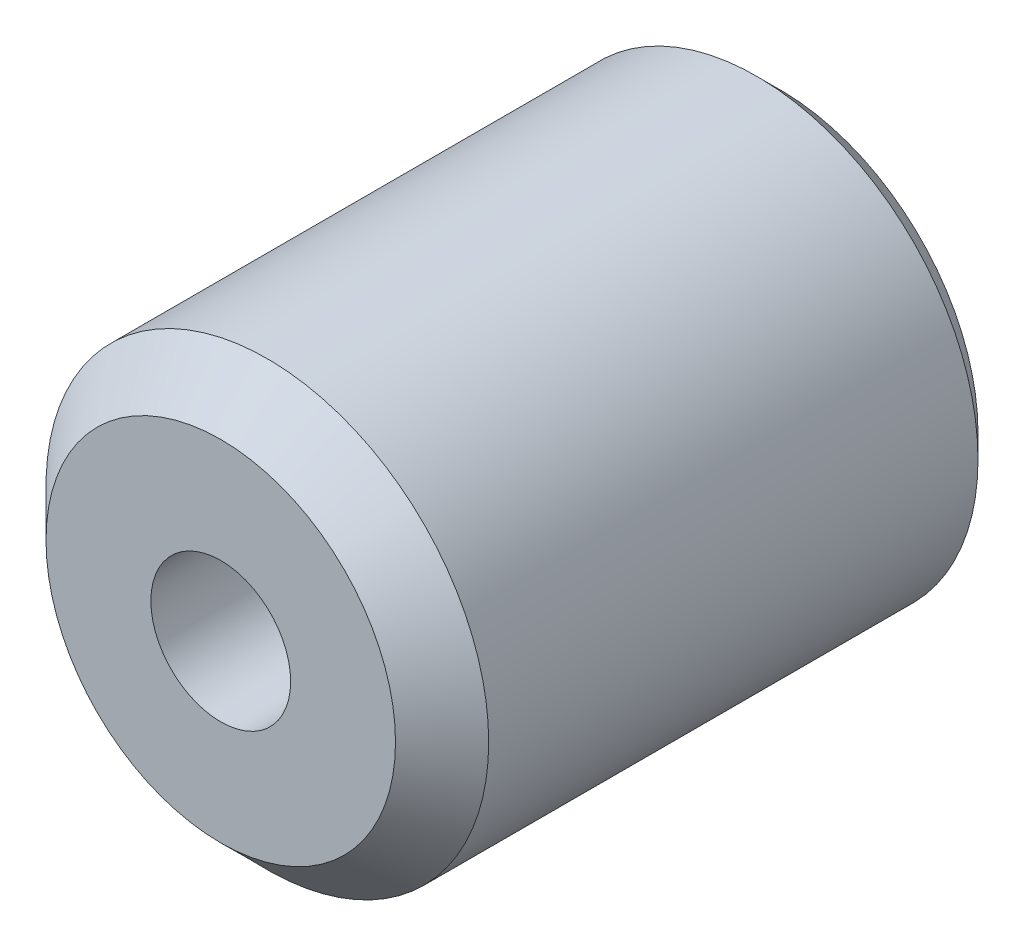
ISO-10303-21;
HEADER;
FILE_DESCRIPTION(('STEP AP214'),'2;1');
FILE_NAME('part.step','',(''),(''),'','','');
FILE_SCHEMA(('AUTOMOTIVE_DESIGN { 1 0 10303 214 1 1 1 1 }'));
ENDSEC;
DATA;
#1=APPLICATION_CONTEXT('core data for automotive mechanical design processes');
#2=APPLICATION_PROTOCOL_DEFINITION('international standard','automotive_design',2000,#1);
#3=PRODUCT_CONTEXT('',#1,'mechanical');
#4=PRODUCT('Part','Part','',(#3));
#5=PRODUCT_RELATED_PRODUCT_CATEGORY('part','',(#4));
#6=PRODUCT_DEFINITION_FORMATION('','',#4);
#7=PRODUCT_DEFINITION_CONTEXT('part definition',#1,'design');
#8=PRODUCT_DEFINITION('design','',#6,#7);
#9=PRODUCT_DEFINITION_SHAPE('','',#8);
#10=(LENGTH_UNIT() NAMED_UNIT(*) SI_UNIT(.MILLI.,.METRE.));
#11=(NAMED_UNIT(*) PLANE_ANGLE_UNIT() SI_UNIT($,.RADIAN.));
#12=(NAMED_UNIT(*) SI_UNIT($,.STERADIAN.) SOLID_ANGLE_UNIT());
#13=UNCERTAINTY_MEASURE_WITH_UNIT(LENGTH_MEASURE(1.E-05),#10,'distance_accuracy_value','');
#14=(GEOMETRIC_REPRESENTATION_CONTEXT(3) GLOBAL_UNCERTAINTY_ASSIGNED_CONTEXT((#13)) GLOBAL_UNIT_ASSIGNED_CONTEXT((#10,
#11,#12)) REPRESENTATION_CONTEXT('',''));
#15=CARTESIAN_POINT('',(0.,0.,0.));
#16=DIRECTION('',(0.,0.,1.));
#17=DIRECTION('',(1.,0.,0.));
#18=AXIS2_PLACEMENT_3D('',#15,#16,#17);
#19=CARTESIAN_POINT('',(0.,0.,12.));
#20=DIRECTION('',(0.,0.,-1.));
#21=DIRECTION('',(-1.,0.,0.));
#22=AXIS2_PLACEMENT_3D('',#19,#20,#21);
#23=CYLINDRICAL_SURFACE('',#22,9.5);
#24=CARTESIAN_POINT('',(0.,0.,-11.));
#25=DIRECTION('',(0.,0.,1.));
#26=DIRECTION('',(1.,0.,0.));
#27=AXIS2_PLACEMENT_3D('',#24,#25,#26);
#28=CIRCLE('',#27,9.5);
#29=CARTESIAN_POINT('',(9.5,0.,-11.));
#30=VERTEX_POINT('',#29);
#31=EDGE_CURVE('E53',#30,#30,#28,.T.);
#32=ORIENTED_EDGE('',*,*,#31,.T.);
#33=EDGE_LOOP('',(#32));
#34=FACE_BOUND('',#33,.T.);
#35=CARTESIAN_POINT('',(0.,0.,10.));
#36=DIRECTION('',(0.,0.,1.));
#37=DIRECTION('',(1.,0.,0.));
#38=AXIS2_PLACEMENT_3D('',#35,#36,#37);
#39=CIRCLE('',#38,9.5);
#40=CARTESIAN_POINT('',(9.5,0.,10.));
#41=VERTEX_POINT('',#40);
#42=EDGE_CURVE('E58',#41,#41,#39,.F.);
#43=ORIENTED_EDGE('',*,*,#42,.T.);
#44=EDGE_LOOP('',(#43));
#45=FACE_BOUND('',#44,.T.);
#46=ADVANCED_FACE('F43',(#34,#45),#23,.T.);
#47=CARTESIAN_POINT('',(0.,0.,12.));
#48=DIRECTION('',(0.,0.,1.));
#49=DIRECTION('',(1.,0.,0.));
#50=AXIS2_PLACEMENT_3D('',#47,#48,#49);
#51=PLANE('',#50);
#52=CARTESIAN_POINT('',(0.,0.,12.));
#53=DIRECTION('',(0.,0.,1.));
#54=DIRECTION('',(1.,0.,0.));
#55=AXIS2_PLACEMENT_3D('',#52,#53,#54);
#56=CIRCLE('',#55,3.);
#57=CARTESIAN_POINT('',(3.,0.,12.));
#58=VERTEX_POINT('',#57);
#59=EDGE_CURVE('E48',#58,#58,#56,.T.);
#60=ORIENTED_EDGE('',*,*,#59,.F.);
#61=EDGE_LOOP('',(#60));
#62=FACE_BOUND('',#61,.T.);
#63=CARTESIAN_POINT('',(0.,0.,12.));
#64=DIRECTION('',(0.,0.,1.));
#65=DIRECTION('',(1.,0.,0.));
#66=AXIS2_PLACEMENT_3D('',#63,#64,#65);
#67=CIRCLE('',#66,7.50000000000001);
#68=CARTESIAN_POINT('',(7.50000000000001,0.,12.));
#69=VERTEX_POINT('',#68);
#70=EDGE_CURVE('E64',#69,#69,#67,.T.);
#71=ORIENTED_EDGE('',*,*,#70,.T.);
#72=EDGE_LOOP('',(#71));
#73=FACE_BOUND('',#72,.T.);
#74=ADVANCED_FACE('F87',(#62,#73),#51,.T.);
#75=CARTESIAN_POINT('',(0.,0.,-12.));
#76=DIRECTION('',(0.,0.,1.));
#77=DIRECTION('',(1.,0.,0.));
#78=AXIS2_PLACEMENT_3D('',#75,#76,#77);
#79=PLANE('',#78);
#80=CARTESIAN_POINT('',(0.,0.,-12.));
#81=DIRECTION('',(0.,0.,-1.));
#82=DIRECTION('',(-1.,0.,0.));
#83=AXIS2_PLACEMENT_3D('',#80,#81,#82);
#84=CIRCLE('',#83,7.);
#85=CARTESIAN_POINT('',(-7.,0.,-12.));
#86=VERTEX_POINT('',#85);
#87=EDGE_CURVE('E69',#86,#86,#84,.T.);
#88=ORIENTED_EDGE('',*,*,#87,.F.);
#89=EDGE_LOOP('',(#88));
#90=FACE_BOUND('',#89,.T.);
#91=CARTESIAN_POINT('',(0.,0.,-12.));
#92=DIRECTION('',(0.,0.,1.));
#93=DIRECTION('',(1.,0.,0.));
#94=AXIS2_PLACEMENT_3D('',#91,#92,#93);
#95=CIRCLE('',#94,8.5);
#96=CARTESIAN_POINT('',(8.5,0.,-12.));
#97=VERTEX_POINT('',#96);
#98=EDGE_CURVE('E10',#97,#97,#95,.F.);
#99=ORIENTED_EDGE('',*,*,#98,.T.);
#100=EDGE_LOOP('',(#99));
#101=FACE_BOUND('',#100,.T.);
#102=ADVANCED_FACE('F90',(#90,#101),#79,.F.);
#103=CARTESIAN_POINT('',(0.,0.,12.));
#104=DIRECTION('',(0.,0.,-1.));
#105=DIRECTION('',(-1.,0.,0.));
#106=AXIS2_PLACEMENT_3D('',#103,#104,#105);
#107=CONICAL_SURFACE('',#106,7.50000000000001,0.785398163397445);
#108=ORIENTED_EDGE('',*,*,#42,.F.);
#109=EDGE_LOOP('',(#108));
#110=FACE_BOUND('',#109,.T.);
#111=ORIENTED_EDGE('',*,*,#70,.F.);
#112=EDGE_LOOP('',(#111));
#113=FACE_BOUND('',#112,.T.);
#114=ADVANCED_FACE('F94',(#110,#113),#107,.T.);
#115=CARTESIAN_POINT('',(0.,0.,-11.));
#116=DIRECTION('',(0.,0.,1.));
#117=DIRECTION('',(1.,0.,0.));
#118=AXIS2_PLACEMENT_3D('',#115,#116,#117);
#119=CONICAL_SURFACE('',#118,9.5,0.785398163397451);
#120=ORIENTED_EDGE('',*,*,#98,.F.);
#121=EDGE_LOOP('',(#120));
#122=FACE_BOUND('',#121,.T.);
#123=ORIENTED_EDGE('',*,*,#31,.F.);
#124=EDGE_LOOP('',(#123));
#125=FACE_BOUND('',#124,.T.);
#126=ADVANCED_FACE('F46',(#122,#125),#119,.T.);
#127=CARTESIAN_POINT('',(0.,0.,2.));
#128=DIRECTION('',(0.,0.,-1.));
#129=DIRECTION('',(-1.,0.,0.));
#130=AXIS2_PLACEMENT_3D('',#127,#128,#129);
#131=CYLINDRICAL_SURFACE('',#130,7.);
#132=CARTESIAN_POINT('',(0.,0.,2.));
#133=DIRECTION('',(0.,0.,-1.));
#134=DIRECTION('',(-1.,0.,0.));
#135=AXIS2_PLACEMENT_3D('',#132,#133,#134);
#136=CIRCLE('',#135,7.);
#137=CARTESIAN_POINT('',(-7.,0.,2.));
#138=VERTEX_POINT('',#137);
#139=EDGE_CURVE('E68',#138,#138,#136,.T.);
#140=ORIENTED_EDGE('',*,*,#139,.F.);
#141=EDGE_LOOP('',(#140));
#142=FACE_BOUND('',#141,.T.);
#143=ORIENTED_EDGE('',*,*,#87,.T.);
#144=EDGE_LOOP('',(#143));
#145=FACE_BOUND('',#144,.T.);
#146=ADVANCED_FACE('F101',(#142,#145),#131,.F.);
#147=CARTESIAN_POINT('',(0.,0.,2.));
#148=DIRECTION('',(0.,0.,-1.));
#149=DIRECTION('',(-1.,0.,0.));
#150=AXIS2_PLACEMENT_3D('',#147,#148,#149);
#151=PLANE('',#150);
#152=CARTESIAN_POINT('',(0.,0.,2.));
#153=DIRECTION('',(0.,0.,-1.));
#154=DIRECTION('',(-1.,0.,0.));
#155=AXIS2_PLACEMENT_3D('',#152,#153,#154);
#156=CIRCLE('',#155,3.);
#157=CARTESIAN_POINT('',(-3.,0.,2.));
#158=VERTEX_POINT('',#157);
#159=EDGE_CURVE('E76',#158,#158,#156,.T.);
#160=ORIENTED_EDGE('',*,*,#159,.F.);
#161=EDGE_LOOP('',(#160));
#162=FACE_BOUND('',#161,.T.);
#163=ORIENTED_EDGE('',*,*,#139,.T.);
#164=EDGE_LOOP('',(#163));
#165=FACE_BOUND('',#164,.T.);
#166=ADVANCED_FACE('F116',(#162,#165),#151,.T.);
#167=CARTESIAN_POINT('',(0.,0.,16.));
#168=DIRECTION('',(0.,0.,-1.));
#169=DIRECTION('',(-1.,0.,0.));
#170=AXIS2_PLACEMENT_3D('',#167,#168,#169);
#171=CYLINDRICAL_SURFACE('',#170,3.);
#172=ORIENTED_EDGE('',*,*,#59,.T.);
#173=EDGE_LOOP('',(#172));
#174=FACE_BOUND('',#173,.T.);
#175=ORIENTED_EDGE('',*,*,#159,.T.);
#176=EDGE_LOOP('',(#175));
#177=FACE_BOUND('',#176,.T.);
#178=ADVANCED_FACE('F85',(#174,#177),#171,.F.);
#179=CLOSED_SHELL('',(#46,#74,#102,#114,#126,#146,#166,#178));
#180=MANIFOLD_SOLID_BREP('B2',#179);
#181=ADVANCED_BREP_SHAPE_REPRESENTATION('',(#18,#180),#14);
#182=SHAPE_DEFINITION_REPRESENTATION(#9,#181);
ENDSEC;
END-ISO-10303-21;
